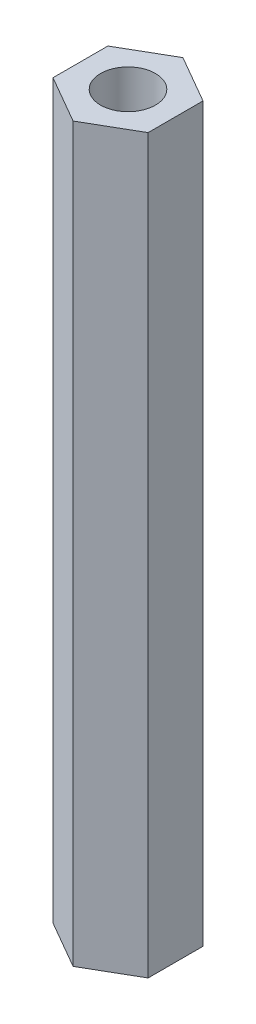
ISO-10303-21;
HEADER;
FILE_DESCRIPTION(('STEP AP214'),'2;1');
FILE_NAME('part.step','',(''),(''),'','','');
FILE_SCHEMA(('AUTOMOTIVE_DESIGN { 1 0 10303 214 1 1 1 1 }'));
ENDSEC;
DATA;
#1=APPLICATION_CONTEXT('core data for automotive mechanical design processes');
#2=APPLICATION_PROTOCOL_DEFINITION('international standard','automotive_design',2000,#1);
#3=PRODUCT_CONTEXT('',#1,'mechanical');
#4=PRODUCT('Part','Part','',(#3));
#5=PRODUCT_RELATED_PRODUCT_CATEGORY('part','',(#4));
#6=PRODUCT_DEFINITION_FORMATION('','',#4);
#7=PRODUCT_DEFINITION_CONTEXT('part definition',#1,'design');
#8=PRODUCT_DEFINITION('design','',#6,#7);
#9=PRODUCT_DEFINITION_SHAPE('','',#8);
#10=(LENGTH_UNIT() NAMED_UNIT(*) SI_UNIT(.MILLI.,.METRE.));
#11=(NAMED_UNIT(*) PLANE_ANGLE_UNIT() SI_UNIT($,.RADIAN.));
#12=(NAMED_UNIT(*) SI_UNIT($,.STERADIAN.) SOLID_ANGLE_UNIT());
#13=UNCERTAINTY_MEASURE_WITH_UNIT(LENGTH_MEASURE(1.E-05),#10,'distance_accuracy_value','');
#14=(GEOMETRIC_REPRESENTATION_CONTEXT(3) GLOBAL_UNCERTAINTY_ASSIGNED_CONTEXT((#13)) GLOBAL_UNIT_ASSIGNED_CONTEXT((#10,
#11,#12)) REPRESENTATION_CONTEXT('',''));
#15=CARTESIAN_POINT('',(0.,0.,0.));
#16=DIRECTION('',(0.,0.,1.));
#17=DIRECTION('',(1.,0.,0.));
#18=AXIS2_PLACEMENT_3D('',#15,#16,#17);
#19=CARTESIAN_POINT('',(0.,40.,0.));
#20=DIRECTION('',(0.,1.,0.));
#21=DIRECTION('',(0.,0.,1.));
#22=AXIS2_PLACEMENT_3D('',#19,#20,#21);
#23=PLANE('',#22);
#24=DIRECTION('',(-0.866025403784439,0.,-0.499999999999999));
#25=VECTOR('',#24,1.);
#26=CARTESIAN_POINT('',(2.59807621135331,40.,-1.50000000000001));
#27=LINE('',#26,#25);
#28=CARTESIAN_POINT('',(2.59807621135331,40.,-1.50000000000001));
#29=VERTEX_POINT('',#28);
#30=CARTESIAN_POINT('',(0.,40.,-3.));
#31=VERTEX_POINT('',#30);
#32=EDGE_CURVE('E130',#29,#31,#27,.T.);
#33=ORIENTED_EDGE('',*,*,#32,.T.);
#34=DIRECTION('',(-0.866025403784439,0.,0.499999999999999));
#35=VECTOR('',#34,1.);
#36=CARTESIAN_POINT('',(0.,40.,-3.));
#37=LINE('',#36,#35);
#38=CARTESIAN_POINT('',(-2.59807621135331,40.,-1.5));
#39=VERTEX_POINT('',#38);
#40=EDGE_CURVE('E88',#31,#39,#37,.T.);
#41=ORIENTED_EDGE('',*,*,#40,.T.);
#42=DIRECTION('',(0.,0.,1.));
#43=VECTOR('',#42,1.);
#44=CARTESIAN_POINT('',(-2.59807621135331,40.,-1.5));
#45=LINE('',#44,#43);
#46=CARTESIAN_POINT('',(-2.59807621135331,40.,1.50000000000001));
#47=VERTEX_POINT('',#46);
#48=EDGE_CURVE('E101',#39,#47,#45,.T.);
#49=ORIENTED_EDGE('',*,*,#48,.T.);
#50=DIRECTION('',(0.866025403784439,0.,0.499999999999999));
#51=VECTOR('',#50,1.);
#52=CARTESIAN_POINT('',(-2.59807621135331,40.,1.50000000000001));
#53=LINE('',#52,#51);
#54=CARTESIAN_POINT('',(0.,40.,3.));
#55=VERTEX_POINT('',#54);
#56=EDGE_CURVE('E95',#47,#55,#53,.T.);
#57=ORIENTED_EDGE('',*,*,#56,.T.);
#58=DIRECTION('',(0.866025403784439,0.,-0.499999999999999));
#59=VECTOR('',#58,1.);
#60=CARTESIAN_POINT('',(0.,40.,3.));
#61=LINE('',#60,#59);
#62=CARTESIAN_POINT('',(2.59807621135331,40.,1.5));
#63=VERTEX_POINT('',#62);
#64=EDGE_CURVE('E99',#55,#63,#61,.T.);
#65=ORIENTED_EDGE('',*,*,#64,.T.);
#66=DIRECTION('',(0.,0.,-1.));
#67=VECTOR('',#66,1.);
#68=CARTESIAN_POINT('',(2.59807621135331,40.,1.5));
#69=LINE('',#68,#67);
#70=EDGE_CURVE('E51',#63,#29,#69,.T.);
#71=ORIENTED_EDGE('',*,*,#70,.T.);
#72=EDGE_LOOP('',(#33,#41,#49,#57,#65,#71));
#73=FACE_BOUND('',#72,.T.);
#74=CARTESIAN_POINT('',(0.,40.,0.));
#75=DIRECTION('',(0.,1.,0.));
#76=DIRECTION('',(0.,0.,1.));
#77=AXIS2_PLACEMENT_3D('',#74,#75,#76);
#78=CIRCLE('',#77,1.5);
#79=CARTESIAN_POINT('',(0.,40.,1.5));
#80=VERTEX_POINT('',#79);
#81=EDGE_CURVE('E123',#80,#80,#78,.T.);
#82=ORIENTED_EDGE('',*,*,#81,.F.);
#83=EDGE_LOOP('',(#82));
#84=FACE_BOUND('',#83,.T.);
#85=ADVANCED_FACE('F34',(#73,#84),#23,.T.);
#86=CARTESIAN_POINT('',(0.,0.,0.));
#87=DIRECTION('',(0.,1.,0.));
#88=DIRECTION('',(0.,0.,1.));
#89=AXIS2_PLACEMENT_3D('',#86,#87,#88);
#90=PLANE('',#89);
#91=DIRECTION('',(-0.866025403784439,0.,-0.499999999999999));
#92=VECTOR('',#91,1.);
#93=CARTESIAN_POINT('',(2.59807621135331,0.,-1.50000000000001));
#94=LINE('',#93,#92);
#95=CARTESIAN_POINT('',(2.59807621135331,0.,-1.50000000000001));
#96=VERTEX_POINT('',#95);
#97=CARTESIAN_POINT('',(0.,0.,-3.));
#98=VERTEX_POINT('',#97);
#99=EDGE_CURVE('E119',#96,#98,#94,.T.);
#100=ORIENTED_EDGE('',*,*,#99,.F.);
#101=DIRECTION('',(0.,0.,-1.));
#102=VECTOR('',#101,1.);
#103=CARTESIAN_POINT('',(2.59807621135331,0.,1.5));
#104=LINE('',#103,#102);
#105=CARTESIAN_POINT('',(2.59807621135331,0.,1.5));
#106=VERTEX_POINT('',#105);
#107=EDGE_CURVE('E80',#106,#96,#104,.T.);
#108=ORIENTED_EDGE('',*,*,#107,.F.);
#109=DIRECTION('',(0.866025403784439,0.,-0.499999999999999));
#110=VECTOR('',#109,1.);
#111=CARTESIAN_POINT('',(0.,0.,3.));
#112=LINE('',#111,#110);
#113=CARTESIAN_POINT('',(0.,0.,3.));
#114=VERTEX_POINT('',#113);
#115=EDGE_CURVE('E74',#114,#106,#112,.T.);
#116=ORIENTED_EDGE('',*,*,#115,.F.);
#117=DIRECTION('',(0.866025403784439,0.,0.499999999999999));
#118=VECTOR('',#117,1.);
#119=CARTESIAN_POINT('',(-2.59807621135331,0.,1.50000000000001));
#120=LINE('',#119,#118);
#121=CARTESIAN_POINT('',(-2.59807621135331,0.,1.50000000000001));
#122=VERTEX_POINT('',#121);
#123=EDGE_CURVE('E109',#122,#114,#120,.T.);
#124=ORIENTED_EDGE('',*,*,#123,.F.);
#125=DIRECTION('',(0.,0.,1.));
#126=VECTOR('',#125,1.);
#127=CARTESIAN_POINT('',(-2.59807621135331,0.,-1.5));
#128=LINE('',#127,#126);
#129=CARTESIAN_POINT('',(-2.59807621135331,0.,-1.5));
#130=VERTEX_POINT('',#129);
#131=EDGE_CURVE('E125',#130,#122,#128,.T.);
#132=ORIENTED_EDGE('',*,*,#131,.F.);
#133=DIRECTION('',(-0.866025403784439,0.,0.499999999999999));
#134=VECTOR('',#133,1.);
#135=CARTESIAN_POINT('',(0.,0.,-3.));
#136=LINE('',#135,#134);
#137=EDGE_CURVE('E122',#98,#130,#136,.T.);
#138=ORIENTED_EDGE('',*,*,#137,.F.);
#139=EDGE_LOOP('',(#100,#108,#116,#124,#132,#138));
#140=FACE_BOUND('',#139,.T.);
#141=CARTESIAN_POINT('',(0.,0.,0.));
#142=DIRECTION('',(0.,1.,0.));
#143=DIRECTION('',(0.,0.,1.));
#144=AXIS2_PLACEMENT_3D('',#141,#142,#143);
#145=CIRCLE('',#144,1.5);
#146=CARTESIAN_POINT('',(0.,0.,1.5));
#147=VERTEX_POINT('',#146);
#148=EDGE_CURVE('E223',#147,#147,#145,.T.);
#149=ORIENTED_EDGE('',*,*,#148,.T.);
#150=EDGE_LOOP('',(#149));
#151=FACE_BOUND('',#150,.T.);
#152=ADVANCED_FACE('F139',(#140,#151),#90,.F.);
#153=CARTESIAN_POINT('',(2.59807621135331,40.,-1.50000000000001));
#154=DIRECTION('',(-0.499999999999999,0.,0.866025403784439));
#155=DIRECTION('',(0.866025403784439,0.,0.499999999999999));
#156=AXIS2_PLACEMENT_3D('',#153,#154,#155);
#157=PLANE('',#156);
#158=ORIENTED_EDGE('',*,*,#99,.T.);
#159=DIRECTION('',(0.,-1.,0.));
#160=VECTOR('',#159,1.);
#161=CARTESIAN_POINT('',(0.,40.,-3.));
#162=LINE('',#161,#160);
#163=EDGE_CURVE('E11',#31,#98,#162,.T.);
#164=ORIENTED_EDGE('',*,*,#163,.F.);
#165=ORIENTED_EDGE('',*,*,#32,.F.);
#166=DIRECTION('',(0.,-1.,0.));
#167=VECTOR('',#166,1.);
#168=CARTESIAN_POINT('',(2.59807621135331,40.,-1.50000000000001));
#169=LINE('',#168,#167);
#170=EDGE_CURVE('E115',#29,#96,#169,.T.);
#171=ORIENTED_EDGE('',*,*,#170,.T.);
#172=EDGE_LOOP('',(#158,#164,#165,#171));
#173=FACE_BOUND('',#172,.T.);
#174=ADVANCED_FACE('F36',(#173),#157,.F.);
#175=CARTESIAN_POINT('',(0.,40.,-3.));
#176=DIRECTION('',(0.499999999999999,0.,0.866025403784439));
#177=DIRECTION('',(0.866025403784439,0.,-0.499999999999999));
#178=AXIS2_PLACEMENT_3D('',#175,#176,#177);
#179=PLANE('',#178);
#180=ORIENTED_EDGE('',*,*,#137,.T.);
#181=DIRECTION('',(0.,-1.,0.));
#182=VECTOR('',#181,1.);
#183=CARTESIAN_POINT('',(-2.59807621135331,40.,-1.5));
#184=LINE('',#183,#182);
#185=EDGE_CURVE('E43',#39,#130,#184,.T.);
#186=ORIENTED_EDGE('',*,*,#185,.F.);
#187=ORIENTED_EDGE('',*,*,#40,.F.);
#188=ORIENTED_EDGE('',*,*,#163,.T.);
#189=EDGE_LOOP('',(#180,#186,#187,#188));
#190=FACE_BOUND('',#189,.T.);
#191=ADVANCED_FACE('F164',(#190),#179,.F.);
#192=CARTESIAN_POINT('',(-2.59807621135331,40.,-1.5));
#193=DIRECTION('',(1.,0.,0.));
#194=DIRECTION('',(0.,0.,-1.));
#195=AXIS2_PLACEMENT_3D('',#192,#193,#194);
#196=PLANE('',#195);
#197=ORIENTED_EDGE('',*,*,#131,.T.);
#198=DIRECTION('',(0.,-1.,0.));
#199=VECTOR('',#198,1.);
#200=CARTESIAN_POINT('',(-2.59807621135331,40.,1.50000000000001));
#201=LINE('',#200,#199);
#202=EDGE_CURVE('E110',#47,#122,#201,.T.);
#203=ORIENTED_EDGE('',*,*,#202,.F.);
#204=ORIENTED_EDGE('',*,*,#48,.F.);
#205=ORIENTED_EDGE('',*,*,#185,.T.);
#206=EDGE_LOOP('',(#197,#203,#204,#205));
#207=FACE_BOUND('',#206,.T.);
#208=ADVANCED_FACE('F136',(#207),#196,.F.);
#209=CARTESIAN_POINT('',(-2.59807621135331,40.,1.50000000000001));
#210=DIRECTION('',(0.499999999999999,0.,-0.866025403784439));
#211=DIRECTION('',(-0.866025403784439,0.,-0.499999999999999));
#212=AXIS2_PLACEMENT_3D('',#209,#210,#211);
#213=PLANE('',#212);
#214=ORIENTED_EDGE('',*,*,#123,.T.);
#215=DIRECTION('',(0.,-1.,0.));
#216=VECTOR('',#215,1.);
#217=CARTESIAN_POINT('',(0.,40.,3.));
#218=LINE('',#217,#216);
#219=EDGE_CURVE('E106',#55,#114,#218,.T.);
#220=ORIENTED_EDGE('',*,*,#219,.F.);
#221=ORIENTED_EDGE('',*,*,#56,.F.);
#222=ORIENTED_EDGE('',*,*,#202,.T.);
#223=EDGE_LOOP('',(#214,#220,#221,#222));
#224=FACE_BOUND('',#223,.T.);
#225=ADVANCED_FACE('F107',(#224),#213,.F.);
#226=CARTESIAN_POINT('',(0.,40.,3.));
#227=DIRECTION('',(-0.499999999999999,0.,-0.866025403784439));
#228=DIRECTION('',(-0.866025403784439,0.,0.499999999999999));
#229=AXIS2_PLACEMENT_3D('',#226,#227,#228);
#230=PLANE('',#229);
#231=ORIENTED_EDGE('',*,*,#115,.T.);
#232=DIRECTION('',(0.,-1.,0.));
#233=VECTOR('',#232,1.);
#234=CARTESIAN_POINT('',(2.59807621135331,40.,1.5));
#235=LINE('',#234,#233);
#236=EDGE_CURVE('E111',#63,#106,#235,.T.);
#237=ORIENTED_EDGE('',*,*,#236,.F.);
#238=ORIENTED_EDGE('',*,*,#64,.F.);
#239=ORIENTED_EDGE('',*,*,#219,.T.);
#240=EDGE_LOOP('',(#231,#237,#238,#239));
#241=FACE_BOUND('',#240,.T.);
#242=ADVANCED_FACE('F113',(#241),#230,.F.);
#243=CARTESIAN_POINT('',(2.59807621135331,40.,1.5));
#244=DIRECTION('',(-1.,0.,0.));
#245=DIRECTION('',(0.,0.,1.));
#246=AXIS2_PLACEMENT_3D('',#243,#244,#245);
#247=PLANE('',#246);
#248=ORIENTED_EDGE('',*,*,#107,.T.);
#249=ORIENTED_EDGE('',*,*,#170,.F.);
#250=ORIENTED_EDGE('',*,*,#70,.F.);
#251=ORIENTED_EDGE('',*,*,#236,.T.);
#252=EDGE_LOOP('',(#248,#249,#250,#251));
#253=FACE_BOUND('',#252,.T.);
#254=ADVANCED_FACE('F144',(#253),#247,.F.);
#255=CARTESIAN_POINT('',(0.,40.,0.));
#256=DIRECTION('',(0.,-1.,0.));
#257=DIRECTION('',(0.,0.,-1.));
#258=AXIS2_PLACEMENT_3D('',#255,#256,#257);
#259=CYLINDRICAL_SURFACE('',#258,1.5);
#260=ORIENTED_EDGE('',*,*,#81,.T.);
#261=EDGE_LOOP('',(#260));
#262=FACE_BOUND('',#261,.T.);
#263=ORIENTED_EDGE('',*,*,#148,.F.);
#264=EDGE_LOOP('',(#263));
#265=FACE_BOUND('',#264,.T.);
#266=ADVANCED_FACE('F146',(#262,#265),#259,.F.);
#267=CLOSED_SHELL('',(#85,#152,#174,#191,#208,#225,#242,#254,#266));
#268=MANIFOLD_SOLID_BREP('B2',#267);
#269=ADVANCED_BREP_SHAPE_REPRESENTATION('',(#18,#268),#14);
#270=SHAPE_DEFINITION_REPRESENTATION(#9,#269);
ENDSEC;
END-ISO-10303-21;
